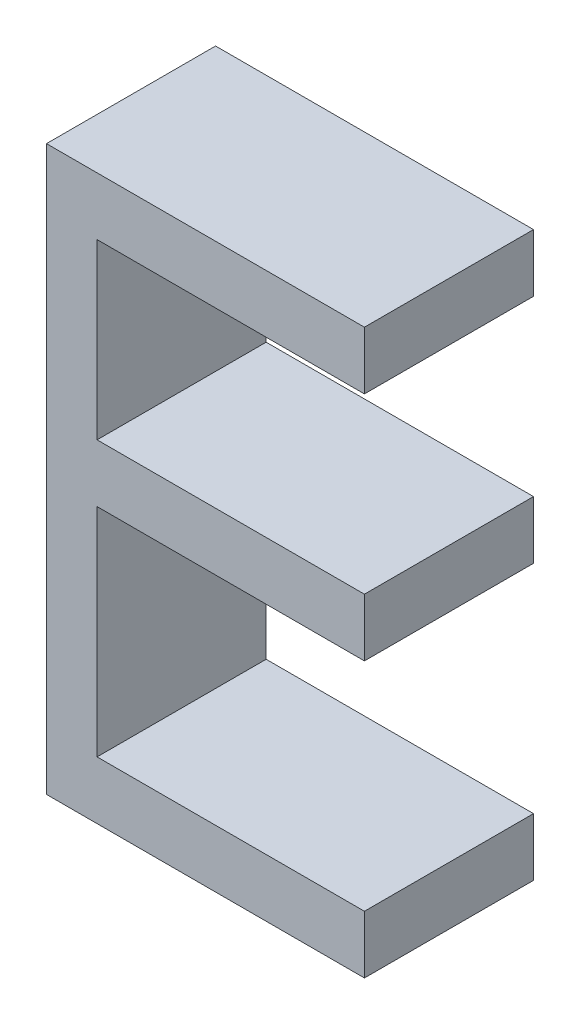
ISO-10303-21;
HEADER;
FILE_DESCRIPTION(('STEP AP214'),'2;1');
FILE_NAME('part.step','',(''),(''),'','','');
FILE_SCHEMA(('AUTOMOTIVE_DESIGN { 1 0 10303 214 1 1 1 1 }'));
ENDSEC;
DATA;
#1=APPLICATION_CONTEXT('core data for automotive mechanical design processes');
#2=APPLICATION_PROTOCOL_DEFINITION('international standard','automotive_design',2000,#1);
#3=PRODUCT_CONTEXT('',#1,'mechanical');
#4=PRODUCT('Part','Part','',(#3));
#5=PRODUCT_RELATED_PRODUCT_CATEGORY('part','',(#4));
#6=PRODUCT_DEFINITION_FORMATION('','',#4);
#7=PRODUCT_DEFINITION_CONTEXT('part definition',#1,'design');
#8=PRODUCT_DEFINITION('design','',#6,#7);
#9=PRODUCT_DEFINITION_SHAPE('','',#8);
#10=(LENGTH_UNIT() NAMED_UNIT(*) SI_UNIT(.MILLI.,.METRE.));
#11=(NAMED_UNIT(*) PLANE_ANGLE_UNIT() SI_UNIT($,.RADIAN.));
#12=(NAMED_UNIT(*) SI_UNIT($,.STERADIAN.) SOLID_ANGLE_UNIT());
#13=UNCERTAINTY_MEASURE_WITH_UNIT(LENGTH_MEASURE(1.E-05),#10,'distance_accuracy_value','');
#14=(GEOMETRIC_REPRESENTATION_CONTEXT(3) GLOBAL_UNCERTAINTY_ASSIGNED_CONTEXT((#13)) GLOBAL_UNIT_ASSIGNED_CONTEXT((#10,
#11,#12)) REPRESENTATION_CONTEXT('',''));
#15=CARTESIAN_POINT('',(0.,0.,0.));
#16=DIRECTION('',(0.,0.,1.));
#17=DIRECTION('',(1.,0.,0.));
#18=AXIS2_PLACEMENT_3D('',#15,#16,#17);
#19=CARTESIAN_POINT('',(-55.4324653258695,-22.8701190762308,1.5));
#20=DIRECTION('',(-1.,0.,0.));
#21=DIRECTION('',(0.,0.,1.));
#22=AXIS2_PLACEMENT_3D('',#19,#20,#21);
#23=PLANE('',#22);
#24=DIRECTION('',(0.,1.,0.));
#25=VECTOR('',#24,1.);
#26=CARTESIAN_POINT('',(-55.4324653258695,-22.8701190762308,0.));
#27=LINE('',#26,#25);
#28=CARTESIAN_POINT('',(-55.4324653258695,-22.8701190762308,0.));
#29=VERTEX_POINT('',#28);
#30=CARTESIAN_POINT('',(-55.4324653258695,-17.8701190762308,0.));
#31=VERTEX_POINT('',#30);
#32=EDGE_CURVE('E154',#29,#31,#27,.T.);
#33=ORIENTED_EDGE('',*,*,#32,.F.);
#34=DIRECTION('',(0.,0.,-1.));
#35=VECTOR('',#34,1.);
#36=CARTESIAN_POINT('',(-55.4324653258695,-22.8701190762308,1.5));
#37=LINE('',#36,#35);
#38=CARTESIAN_POINT('',(-55.4324653258695,-22.8701190762308,1.5));
#39=VERTEX_POINT('',#38);
#40=EDGE_CURVE('E11',#39,#29,#37,.T.);
#41=ORIENTED_EDGE('',*,*,#40,.F.);
#42=DIRECTION('',(0.,1.,0.));
#43=VECTOR('',#42,1.);
#44=CARTESIAN_POINT('',(-55.4324653258695,-22.8701190762308,1.5));
#45=LINE('',#44,#43);
#46=CARTESIAN_POINT('',(-55.4324653258695,-17.8701190762308,1.5));
#47=VERTEX_POINT('',#46);
#48=EDGE_CURVE('E186',#39,#47,#45,.T.);
#49=ORIENTED_EDGE('',*,*,#48,.T.);
#50=DIRECTION('',(0.,0.,-1.));
#51=VECTOR('',#50,1.);
#52=CARTESIAN_POINT('',(-55.4324653258695,-17.8701190762308,1.5));
#53=LINE('',#52,#51);
#54=EDGE_CURVE('E36',#47,#31,#53,.T.);
#55=ORIENTED_EDGE('',*,*,#54,.T.);
#56=EDGE_LOOP('',(#33,#41,#49,#55));
#57=FACE_BOUND('',#56,.T.);
#58=ADVANCED_FACE('F33',(#57),#23,.T.);
#59=CARTESIAN_POINT('',(-52.6119525053567,-22.8701190762308,1.5));
#60=DIRECTION('',(0.,-1.,0.));
#61=DIRECTION('',(0.,0.,-1.));
#62=AXIS2_PLACEMENT_3D('',#59,#60,#61);
#63=PLANE('',#62);
#64=DIRECTION('',(-1.,0.,0.));
#65=VECTOR('',#64,1.);
#66=CARTESIAN_POINT('',(-52.6119525053567,-22.8701190762308,0.));
#67=LINE('',#66,#65);
#68=CARTESIAN_POINT('',(-52.6119525053567,-22.8701190762308,0.));
#69=VERTEX_POINT('',#68);
#70=EDGE_CURVE('E184',#69,#29,#67,.T.);
#71=ORIENTED_EDGE('',*,*,#70,.F.);
#72=DIRECTION('',(0.,0.,-1.));
#73=VECTOR('',#72,1.);
#74=CARTESIAN_POINT('',(-52.6119525053567,-22.8701190762308,1.5));
#75=LINE('',#74,#73);
#76=CARTESIAN_POINT('',(-52.6119525053567,-22.8701190762308,1.5));
#77=VERTEX_POINT('',#76);
#78=EDGE_CURVE('E42',#77,#69,#75,.T.);
#79=ORIENTED_EDGE('',*,*,#78,.F.);
#80=DIRECTION('',(-1.,0.,0.));
#81=VECTOR('',#80,1.);
#82=CARTESIAN_POINT('',(-52.6119525053567,-22.8701190762308,1.5));
#83=LINE('',#82,#81);
#84=EDGE_CURVE('E144',#77,#39,#83,.T.);
#85=ORIENTED_EDGE('',*,*,#84,.T.);
#86=ORIENTED_EDGE('',*,*,#40,.T.);
#87=EDGE_LOOP('',(#71,#79,#85,#86));
#88=FACE_BOUND('',#87,.T.);
#89=ADVANCED_FACE('F206',(#88),#63,.T.);
#90=CARTESIAN_POINT('',(-52.6119525053567,-22.3572985634103,1.5));
#91=DIRECTION('',(1.,0.,0.));
#92=DIRECTION('',(0.,0.,-1.));
#93=AXIS2_PLACEMENT_3D('',#90,#91,#92);
#94=PLANE('',#93);
#95=DIRECTION('',(0.,-1.,0.));
#96=VECTOR('',#95,1.);
#97=CARTESIAN_POINT('',(-52.6119525053567,-22.3572985634103,0.));
#98=LINE('',#97,#96);
#99=CARTESIAN_POINT('',(-52.6119525053567,-22.3572985634103,0.));
#100=VERTEX_POINT('',#99);
#101=EDGE_CURVE('E131',#100,#69,#98,.T.);
#102=ORIENTED_EDGE('',*,*,#101,.F.);
#103=DIRECTION('',(0.,0.,-1.));
#104=VECTOR('',#103,1.);
#105=CARTESIAN_POINT('',(-52.6119525053567,-22.3572985634103,1.5));
#106=LINE('',#105,#104);
#107=CARTESIAN_POINT('',(-52.6119525053567,-22.3572985634103,1.5));
#108=VERTEX_POINT('',#107);
#109=EDGE_CURVE('E126',#108,#100,#106,.T.);
#110=ORIENTED_EDGE('',*,*,#109,.F.);
#111=DIRECTION('',(0.,-1.,0.));
#112=VECTOR('',#111,1.);
#113=CARTESIAN_POINT('',(-52.6119525053567,-22.3572985634103,1.5));
#114=LINE('',#113,#112);
#115=EDGE_CURVE('E129',#108,#77,#114,.T.);
#116=ORIENTED_EDGE('',*,*,#115,.T.);
#117=ORIENTED_EDGE('',*,*,#78,.T.);
#118=EDGE_LOOP('',(#102,#110,#116,#117));
#119=FACE_BOUND('',#118,.T.);
#120=ADVANCED_FACE('F128',(#119),#94,.T.);
#121=CARTESIAN_POINT('',(-54.9837473771516,-22.3572985634103,1.5));
#122=DIRECTION('',(0.,1.,0.));
#123=DIRECTION('',(0.,0.,1.));
#124=AXIS2_PLACEMENT_3D('',#121,#122,#123);
#125=PLANE('',#124);
#126=DIRECTION('',(1.,0.,0.));
#127=VECTOR('',#126,1.);
#128=CARTESIAN_POINT('',(-54.9837473771516,-22.3572985634103,0.));
#129=LINE('',#128,#127);
#130=CARTESIAN_POINT('',(-54.9837473771516,-22.3572985634103,0.));
#131=VERTEX_POINT('',#130);
#132=EDGE_CURVE('E181',#131,#100,#129,.T.);
#133=ORIENTED_EDGE('',*,*,#132,.F.);
#134=DIRECTION('',(0.,0.,-1.));
#135=VECTOR('',#134,1.);
#136=CARTESIAN_POINT('',(-54.9837473771516,-22.3572985634103,1.5));
#137=LINE('',#136,#135);
#138=CARTESIAN_POINT('',(-54.9837473771516,-22.3572985634103,1.5));
#139=VERTEX_POINT('',#138);
#140=EDGE_CURVE('E136',#139,#131,#137,.T.);
#141=ORIENTED_EDGE('',*,*,#140,.F.);
#142=DIRECTION('',(1.,0.,0.));
#143=VECTOR('',#142,1.);
#144=CARTESIAN_POINT('',(-54.9837473771516,-22.3572985634103,1.5));
#145=LINE('',#144,#143);
#146=EDGE_CURVE('E142',#139,#108,#145,.T.);
#147=ORIENTED_EDGE('',*,*,#146,.T.);
#148=ORIENTED_EDGE('',*,*,#109,.T.);
#149=EDGE_LOOP('',(#133,#141,#147,#148));
#150=FACE_BOUND('',#149,.T.);
#151=ADVANCED_FACE('F146',(#150),#125,.T.);
#152=CARTESIAN_POINT('',(-54.9837473771516,-20.4342216403334,1.5));
#153=DIRECTION('',(1.,0.,0.));
#154=DIRECTION('',(0.,0.,-1.));
#155=AXIS2_PLACEMENT_3D('',#152,#153,#154);
#156=PLANE('',#155);
#157=DIRECTION('',(0.,-1.,0.));
#158=VECTOR('',#157,1.);
#159=CARTESIAN_POINT('',(-54.9837473771516,-20.4342216403334,0.));
#160=LINE('',#159,#158);
#161=CARTESIAN_POINT('',(-54.9837473771516,-20.4342216403334,0.));
#162=VERTEX_POINT('',#161);
#163=EDGE_CURVE('E178',#162,#131,#160,.T.);
#164=ORIENTED_EDGE('',*,*,#163,.F.);
#165=DIRECTION('',(0.,0.,-1.));
#166=VECTOR('',#165,1.);
#167=CARTESIAN_POINT('',(-54.9837473771516,-20.4342216403334,1.5));
#168=LINE('',#167,#166);
#169=CARTESIAN_POINT('',(-54.9837473771516,-20.4342216403334,1.5));
#170=VERTEX_POINT('',#169);
#171=EDGE_CURVE('E190',#170,#162,#168,.T.);
#172=ORIENTED_EDGE('',*,*,#171,.F.);
#173=DIRECTION('',(0.,-1.,0.));
#174=VECTOR('',#173,1.);
#175=CARTESIAN_POINT('',(-54.9837473771516,-20.4342216403334,1.5));
#176=LINE('',#175,#174);
#177=EDGE_CURVE('E147',#170,#139,#176,.T.);
#178=ORIENTED_EDGE('',*,*,#177,.T.);
#179=ORIENTED_EDGE('',*,*,#140,.T.);
#180=EDGE_LOOP('',(#164,#172,#178,#179));
#181=FACE_BOUND('',#180,.T.);
#182=ADVANCED_FACE('F219',(#181),#156,.T.);
#183=CARTESIAN_POINT('',(-52.6119525053567,-20.4342216403334,1.5));
#184=DIRECTION('',(0.,-1.,0.));
#185=DIRECTION('',(0.,0.,-1.));
#186=AXIS2_PLACEMENT_3D('',#183,#184,#185);
#187=PLANE('',#186);
#188=DIRECTION('',(-1.,0.,0.));
#189=VECTOR('',#188,1.);
#190=CARTESIAN_POINT('',(-52.6119525053567,-20.4342216403334,0.));
#191=LINE('',#190,#189);
#192=CARTESIAN_POINT('',(-52.6119525053567,-20.4342216403334,0.));
#193=VERTEX_POINT('',#192);
#194=EDGE_CURVE('E175',#193,#162,#191,.T.);
#195=ORIENTED_EDGE('',*,*,#194,.F.);
#196=DIRECTION('',(0.,0.,-1.));
#197=VECTOR('',#196,1.);
#198=CARTESIAN_POINT('',(-52.6119525053567,-20.4342216403334,1.5));
#199=LINE('',#198,#197);
#200=CARTESIAN_POINT('',(-52.6119525053567,-20.4342216403334,1.5));
#201=VERTEX_POINT('',#200);
#202=EDGE_CURVE('E192',#201,#193,#199,.T.);
#203=ORIENTED_EDGE('',*,*,#202,.F.);
#204=DIRECTION('',(-1.,0.,0.));
#205=VECTOR('',#204,1.);
#206=CARTESIAN_POINT('',(-52.6119525053567,-20.4342216403334,1.5));
#207=LINE('',#206,#205);
#208=EDGE_CURVE('E149',#201,#170,#207,.T.);
#209=ORIENTED_EDGE('',*,*,#208,.T.);
#210=ORIENTED_EDGE('',*,*,#171,.T.);
#211=EDGE_LOOP('',(#195,#203,#209,#210));
#212=FACE_BOUND('',#211,.T.);
#213=ADVANCED_FACE('F222',(#212),#187,.T.);
#214=CARTESIAN_POINT('',(-52.6119525053567,-19.9214011275129,1.5));
#215=DIRECTION('',(1.,0.,0.));
#216=DIRECTION('',(0.,0.,-1.));
#217=AXIS2_PLACEMENT_3D('',#214,#215,#216);
#218=PLANE('',#217);
#219=DIRECTION('',(0.,-1.,0.));
#220=VECTOR('',#219,1.);
#221=CARTESIAN_POINT('',(-52.6119525053567,-19.9214011275129,0.));
#222=LINE('',#221,#220);
#223=CARTESIAN_POINT('',(-52.6119525053567,-19.9214011275129,0.));
#224=VERTEX_POINT('',#223);
#225=EDGE_CURVE('E172',#224,#193,#222,.T.);
#226=ORIENTED_EDGE('',*,*,#225,.F.);
#227=DIRECTION('',(0.,0.,-1.));
#228=VECTOR('',#227,1.);
#229=CARTESIAN_POINT('',(-52.6119525053567,-19.9214011275129,1.5));
#230=LINE('',#229,#228);
#231=CARTESIAN_POINT('',(-52.6119525053567,-19.9214011275129,1.5));
#232=VERTEX_POINT('',#231);
#233=EDGE_CURVE('E194',#232,#224,#230,.T.);
#234=ORIENTED_EDGE('',*,*,#233,.F.);
#235=DIRECTION('',(0.,-1.,0.));
#236=VECTOR('',#235,1.);
#237=CARTESIAN_POINT('',(-52.6119525053567,-19.9214011275129,1.5));
#238=LINE('',#237,#236);
#239=EDGE_CURVE('E366',#232,#201,#238,.T.);
#240=ORIENTED_EDGE('',*,*,#239,.T.);
#241=ORIENTED_EDGE('',*,*,#202,.T.);
#242=EDGE_LOOP('',(#226,#234,#240,#241));
#243=FACE_BOUND('',#242,.T.);
#244=ADVANCED_FACE('F226',(#243),#218,.T.);
#245=CARTESIAN_POINT('',(-54.9837473771516,-19.9214011275129,1.5));
#246=DIRECTION('',(0.,1.,0.));
#247=DIRECTION('',(0.,0.,1.));
#248=AXIS2_PLACEMENT_3D('',#245,#246,#247);
#249=PLANE('',#248);
#250=DIRECTION('',(1.,0.,0.));
#251=VECTOR('',#250,1.);
#252=CARTESIAN_POINT('',(-54.9837473771516,-19.9214011275129,0.));
#253=LINE('',#252,#251);
#254=CARTESIAN_POINT('',(-54.9837473771516,-19.9214011275129,0.));
#255=VERTEX_POINT('',#254);
#256=EDGE_CURVE('E169',#255,#224,#253,.T.);
#257=ORIENTED_EDGE('',*,*,#256,.F.);
#258=DIRECTION('',(0.,0.,-1.));
#259=VECTOR('',#258,1.);
#260=CARTESIAN_POINT('',(-54.9837473771516,-19.9214011275129,1.5));
#261=LINE('',#260,#259);
#262=CARTESIAN_POINT('',(-54.9837473771516,-19.9214011275129,1.5));
#263=VERTEX_POINT('',#262);
#264=EDGE_CURVE('E196',#263,#255,#261,.T.);
#265=ORIENTED_EDGE('',*,*,#264,.F.);
#266=DIRECTION('',(1.,0.,0.));
#267=VECTOR('',#266,1.);
#268=CARTESIAN_POINT('',(-54.9837473771516,-19.9214011275129,1.5));
#269=LINE('',#268,#267);
#270=EDGE_CURVE('E370',#263,#232,#269,.T.);
#271=ORIENTED_EDGE('',*,*,#270,.T.);
#272=ORIENTED_EDGE('',*,*,#233,.T.);
#273=EDGE_LOOP('',(#257,#265,#271,#272));
#274=FACE_BOUND('',#273,.T.);
#275=ADVANCED_FACE('F230',(#274),#249,.T.);
#276=CARTESIAN_POINT('',(-54.9837473771516,-18.3829395890513,1.5));
#277=DIRECTION('',(1.,0.,0.));
#278=DIRECTION('',(0.,0.,-1.));
#279=AXIS2_PLACEMENT_3D('',#276,#277,#278);
#280=PLANE('',#279);
#281=DIRECTION('',(0.,-1.,0.));
#282=VECTOR('',#281,1.);
#283=CARTESIAN_POINT('',(-54.9837473771516,-18.3829395890513,0.));
#284=LINE('',#283,#282);
#285=CARTESIAN_POINT('',(-54.9837473771516,-18.3829395890513,0.));
#286=VERTEX_POINT('',#285);
#287=EDGE_CURVE('E166',#286,#255,#284,.T.);
#288=ORIENTED_EDGE('',*,*,#287,.F.);
#289=DIRECTION('',(0.,0.,-1.));
#290=VECTOR('',#289,1.);
#291=CARTESIAN_POINT('',(-54.9837473771516,-18.3829395890513,1.5));
#292=LINE('',#291,#290);
#293=CARTESIAN_POINT('',(-54.9837473771516,-18.3829395890513,1.5));
#294=VERTEX_POINT('',#293);
#295=EDGE_CURVE('E198',#294,#286,#292,.T.);
#296=ORIENTED_EDGE('',*,*,#295,.F.);
#297=DIRECTION('',(0.,-1.,0.));
#298=VECTOR('',#297,1.);
#299=CARTESIAN_POINT('',(-54.9837473771516,-18.3829395890513,1.5));
#300=LINE('',#299,#298);
#301=EDGE_CURVE('E359',#294,#263,#300,.T.);
#302=ORIENTED_EDGE('',*,*,#301,.T.);
#303=ORIENTED_EDGE('',*,*,#264,.T.);
#304=EDGE_LOOP('',(#288,#296,#302,#303));
#305=FACE_BOUND('',#304,.T.);
#306=ADVANCED_FACE('F234',(#305),#280,.T.);
#307=CARTESIAN_POINT('',(-52.6119525053567,-18.3829395890513,1.5));
#308=DIRECTION('',(0.,-1.,0.));
#309=DIRECTION('',(0.,0.,-1.));
#310=AXIS2_PLACEMENT_3D('',#307,#308,#309);
#311=PLANE('',#310);
#312=DIRECTION('',(-1.,0.,0.));
#313=VECTOR('',#312,1.);
#314=CARTESIAN_POINT('',(-52.6119525053567,-18.3829395890513,0.));
#315=LINE('',#314,#313);
#316=CARTESIAN_POINT('',(-52.6119525053567,-18.3829395890513,0.));
#317=VERTEX_POINT('',#316);
#318=EDGE_CURVE('E163',#317,#286,#315,.T.);
#319=ORIENTED_EDGE('',*,*,#318,.F.);
#320=DIRECTION('',(0.,0.,-1.));
#321=VECTOR('',#320,1.);
#322=CARTESIAN_POINT('',(-52.6119525053567,-18.3829395890513,1.5));
#323=LINE('',#322,#321);
#324=CARTESIAN_POINT('',(-52.6119525053567,-18.3829395890513,1.5));
#325=VERTEX_POINT('',#324);
#326=EDGE_CURVE('E200',#325,#317,#323,.T.);
#327=ORIENTED_EDGE('',*,*,#326,.F.);
#328=DIRECTION('',(-1.,0.,0.));
#329=VECTOR('',#328,1.);
#330=CARTESIAN_POINT('',(-52.6119525053567,-18.3829395890513,1.5));
#331=LINE('',#330,#329);
#332=EDGE_CURVE('E355',#325,#294,#331,.T.);
#333=ORIENTED_EDGE('',*,*,#332,.T.);
#334=ORIENTED_EDGE('',*,*,#295,.T.);
#335=EDGE_LOOP('',(#319,#327,#333,#334));
#336=FACE_BOUND('',#335,.T.);
#337=ADVANCED_FACE('F238',(#336),#311,.T.);
#338=CARTESIAN_POINT('',(-52.6119525053567,-17.8701190762308,1.5));
#339=DIRECTION('',(1.,0.,0.));
#340=DIRECTION('',(0.,0.,-1.));
#341=AXIS2_PLACEMENT_3D('',#338,#339,#340);
#342=PLANE('',#341);
#343=DIRECTION('',(0.,-1.,0.));
#344=VECTOR('',#343,1.);
#345=CARTESIAN_POINT('',(-52.6119525053567,-17.8701190762308,0.));
#346=LINE('',#345,#344);
#347=CARTESIAN_POINT('',(-52.6119525053567,-17.8701190762308,0.));
#348=VERTEX_POINT('',#347);
#349=EDGE_CURVE('E160',#348,#317,#346,.T.);
#350=ORIENTED_EDGE('',*,*,#349,.F.);
#351=DIRECTION('',(0.,0.,-1.));
#352=VECTOR('',#351,1.);
#353=CARTESIAN_POINT('',(-52.6119525053567,-17.8701190762308,1.5));
#354=LINE('',#353,#352);
#355=CARTESIAN_POINT('',(-52.6119525053567,-17.8701190762308,1.5));
#356=VERTEX_POINT('',#355);
#357=EDGE_CURVE('E201',#356,#348,#354,.T.);
#358=ORIENTED_EDGE('',*,*,#357,.F.);
#359=DIRECTION('',(0.,-1.,0.));
#360=VECTOR('',#359,1.);
#361=CARTESIAN_POINT('',(-52.6119525053567,-17.8701190762308,1.5));
#362=LINE('',#361,#360);
#363=EDGE_CURVE('E376',#356,#325,#362,.T.);
#364=ORIENTED_EDGE('',*,*,#363,.T.);
#365=ORIENTED_EDGE('',*,*,#326,.T.);
#366=EDGE_LOOP('',(#350,#358,#364,#365));
#367=FACE_BOUND('',#366,.T.);
#368=ADVANCED_FACE('F242',(#367),#342,.T.);
#369=CARTESIAN_POINT('',(-55.4324653258695,-17.8701190762308,1.5));
#370=DIRECTION('',(0.,1.,0.));
#371=DIRECTION('',(0.,0.,1.));
#372=AXIS2_PLACEMENT_3D('',#369,#370,#371);
#373=PLANE('',#372);
#374=DIRECTION('',(1.,0.,0.));
#375=VECTOR('',#374,1.);
#376=CARTESIAN_POINT('',(-55.4324653258695,-17.8701190762308,0.));
#377=LINE('',#376,#375);
#378=EDGE_CURVE('E157',#31,#348,#377,.T.);
#379=ORIENTED_EDGE('',*,*,#378,.F.);
#380=ORIENTED_EDGE('',*,*,#54,.F.);
#381=DIRECTION('',(1.,0.,0.));
#382=VECTOR('',#381,1.);
#383=CARTESIAN_POINT('',(-55.4324653258695,-17.8701190762308,1.5));
#384=LINE('',#383,#382);
#385=EDGE_CURVE('E378',#47,#356,#384,.T.);
#386=ORIENTED_EDGE('',*,*,#385,.T.);
#387=ORIENTED_EDGE('',*,*,#357,.T.);
#388=EDGE_LOOP('',(#379,#380,#386,#387));
#389=FACE_BOUND('',#388,.T.);
#390=ADVANCED_FACE('F203',(#389),#373,.T.);
#391=CARTESIAN_POINT('',(0.,0.,1.5));
#392=DIRECTION('',(0.,0.,-1.));
#393=DIRECTION('',(-1.,0.,0.));
#394=AXIS2_PLACEMENT_3D('',#391,#392,#393);
#395=PLANE('',#394);
#396=ORIENTED_EDGE('',*,*,#48,.F.);
#397=ORIENTED_EDGE('',*,*,#84,.F.);
#398=ORIENTED_EDGE('',*,*,#115,.F.);
#399=ORIENTED_EDGE('',*,*,#146,.F.);
#400=ORIENTED_EDGE('',*,*,#177,.F.);
#401=ORIENTED_EDGE('',*,*,#208,.F.);
#402=ORIENTED_EDGE('',*,*,#239,.F.);
#403=ORIENTED_EDGE('',*,*,#270,.F.);
#404=ORIENTED_EDGE('',*,*,#301,.F.);
#405=ORIENTED_EDGE('',*,*,#332,.F.);
#406=ORIENTED_EDGE('',*,*,#363,.F.);
#407=ORIENTED_EDGE('',*,*,#385,.F.);
#408=EDGE_LOOP('',(#396,#397,#398,#399,#400,#401,#402,#403,#404,#405,#406,#407));
#409=FACE_BOUND('',#408,.T.);
#410=ADVANCED_FACE('F140',(#409),#395,.F.);
#411=CARTESIAN_POINT('',(0.,0.,0.));
#412=DIRECTION('',(0.,0.,-1.));
#413=DIRECTION('',(-1.,0.,0.));
#414=AXIS2_PLACEMENT_3D('',#411,#412,#413);
#415=PLANE('',#414);
#416=ORIENTED_EDGE('',*,*,#32,.T.);
#417=ORIENTED_EDGE('',*,*,#378,.T.);
#418=ORIENTED_EDGE('',*,*,#349,.T.);
#419=ORIENTED_EDGE('',*,*,#318,.T.);
#420=ORIENTED_EDGE('',*,*,#287,.T.);
#421=ORIENTED_EDGE('',*,*,#256,.T.);
#422=ORIENTED_EDGE('',*,*,#225,.T.);
#423=ORIENTED_EDGE('',*,*,#194,.T.);
#424=ORIENTED_EDGE('',*,*,#163,.T.);
#425=ORIENTED_EDGE('',*,*,#132,.T.);
#426=ORIENTED_EDGE('',*,*,#101,.T.);
#427=ORIENTED_EDGE('',*,*,#70,.T.);
#428=EDGE_LOOP('',(#416,#417,#418,#419,#420,#421,#422,#423,#424,#425,#426,#427));
#429=FACE_BOUND('',#428,.T.);
#430=ADVANCED_FACE('F205',(#429),#415,.T.);
#431=CLOSED_SHELL('',(#58,#89,#120,#151,#182,#213,#244,#275,#306,#337,#368,#390,#410,#430));
#432=MANIFOLD_SOLID_BREP('B2',#431);
#433=ADVANCED_BREP_SHAPE_REPRESENTATION('',(#18,#432),#14);
#434=SHAPE_DEFINITION_REPRESENTATION(#9,#433);
ENDSEC;
END-ISO-10303-21;
